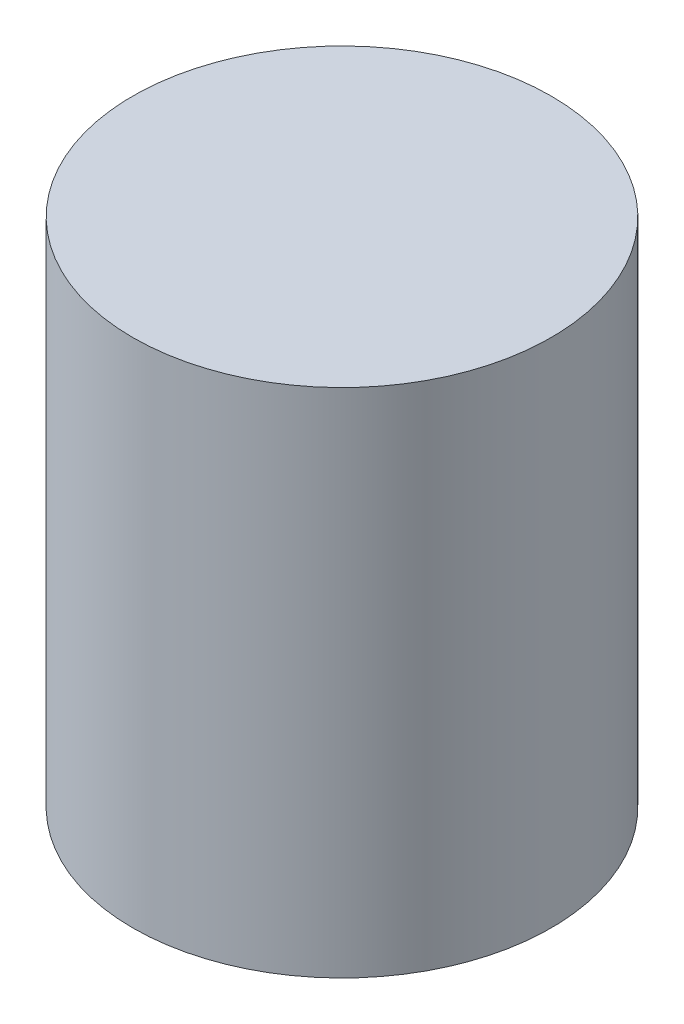
ISO-10303-21;
HEADER;
FILE_DESCRIPTION(('STEP AP214'),'2;1');
FILE_NAME('part.step','',(''),(''),'','','');
FILE_SCHEMA(('AUTOMOTIVE_DESIGN { 1 0 10303 214 1 1 1 1 }'));
ENDSEC;
DATA;
#1=APPLICATION_CONTEXT('core data for automotive mechanical design processes');
#2=APPLICATION_PROTOCOL_DEFINITION('international standard','automotive_design',2000,#1);
#3=PRODUCT_CONTEXT('',#1,'mechanical');
#4=PRODUCT('Part','Part','',(#3));
#5=PRODUCT_RELATED_PRODUCT_CATEGORY('part','',(#4));
#6=PRODUCT_DEFINITION_FORMATION('','',#4);
#7=PRODUCT_DEFINITION_CONTEXT('part definition',#1,'design');
#8=PRODUCT_DEFINITION('design','',#6,#7);
#9=PRODUCT_DEFINITION_SHAPE('','',#8);
#10=(LENGTH_UNIT() NAMED_UNIT(*) SI_UNIT(.MILLI.,.METRE.));
#11=(NAMED_UNIT(*) PLANE_ANGLE_UNIT() SI_UNIT($,.RADIAN.));
#12=(NAMED_UNIT(*) SI_UNIT($,.STERADIAN.) SOLID_ANGLE_UNIT());
#13=UNCERTAINTY_MEASURE_WITH_UNIT(LENGTH_MEASURE(1.E-05),#10,'distance_accuracy_value','');
#14=(GEOMETRIC_REPRESENTATION_CONTEXT(3) GLOBAL_UNCERTAINTY_ASSIGNED_CONTEXT((#13)) GLOBAL_UNIT_ASSIGNED_CONTEXT((#10,
#11,#12)) REPRESENTATION_CONTEXT('',''));
#15=CARTESIAN_POINT('',(0.,0.,0.));
#16=DIRECTION('',(0.,0.,1.));
#17=DIRECTION('',(1.,0.,0.));
#18=AXIS2_PLACEMENT_3D('',#15,#16,#17);
#19=CARTESIAN_POINT('',(0.,33.,0.));
#20=DIRECTION('',(0.,-1.,0.));
#21=DIRECTION('',(0.,0.,-1.));
#22=AXIS2_PLACEMENT_3D('',#19,#20,#21);
#23=CYLINDRICAL_SURFACE('',#22,13.5);
#24=CARTESIAN_POINT('',(0.,33.,0.));
#25=DIRECTION('',(0.,1.,0.));
#26=DIRECTION('',(0.,0.,1.));
#27=AXIS2_PLACEMENT_3D('',#24,#25,#26);
#28=CIRCLE('',#27,13.5);
#29=CARTESIAN_POINT('',(0.,33.,13.5));
#30=VERTEX_POINT('',#29);
#31=EDGE_CURVE('E10',#30,#30,#28,.T.);
#32=ORIENTED_EDGE('',*,*,#31,.F.);
#33=EDGE_LOOP('',(#32));
#34=FACE_BOUND('',#33,.T.);
#35=CARTESIAN_POINT('',(0.,0.,0.));
#36=DIRECTION('',(0.,1.,0.));
#37=DIRECTION('',(0.,0.,1.));
#38=AXIS2_PLACEMENT_3D('',#35,#36,#37);
#39=CIRCLE('',#38,13.5);
#40=CARTESIAN_POINT('',(0.,0.,13.5));
#41=VERTEX_POINT('',#40);
#42=EDGE_CURVE('E36',#41,#41,#39,.T.);
#43=ORIENTED_EDGE('',*,*,#42,.T.);
#44=EDGE_LOOP('',(#43));
#45=FACE_BOUND('',#44,.T.);
#46=ADVANCED_FACE('F33',(#34,#45),#23,.T.);
#47=CARTESIAN_POINT('',(0.,33.,0.));
#48=DIRECTION('',(0.,1.,0.));
#49=DIRECTION('',(0.,0.,1.));
#50=AXIS2_PLACEMENT_3D('',#47,#48,#49);
#51=PLANE('',#50);
#52=ORIENTED_EDGE('',*,*,#31,.T.);
#53=EDGE_LOOP('',(#52));
#54=FACE_BOUND('',#53,.T.);
#55=ADVANCED_FACE('F48',(#54),#51,.T.);
#56=CARTESIAN_POINT('',(0.,0.,0.));
#57=DIRECTION('',(0.,1.,0.));
#58=DIRECTION('',(0.,0.,1.));
#59=AXIS2_PLACEMENT_3D('',#56,#57,#58);
#60=PLANE('',#59);
#61=ORIENTED_EDGE('',*,*,#42,.F.);
#62=EDGE_LOOP('',(#61));
#63=FACE_BOUND('',#62,.T.);
#64=ADVANCED_FACE('F46',(#63),#60,.F.);
#65=CLOSED_SHELL('',(#46,#55,#64));
#66=MANIFOLD_SOLID_BREP('B2',#65);
#67=ADVANCED_BREP_SHAPE_REPRESENTATION('',(#18,#66),#14);
#68=SHAPE_DEFINITION_REPRESENTATION(#9,#67);
ENDSEC;
END-ISO-10303-21;
